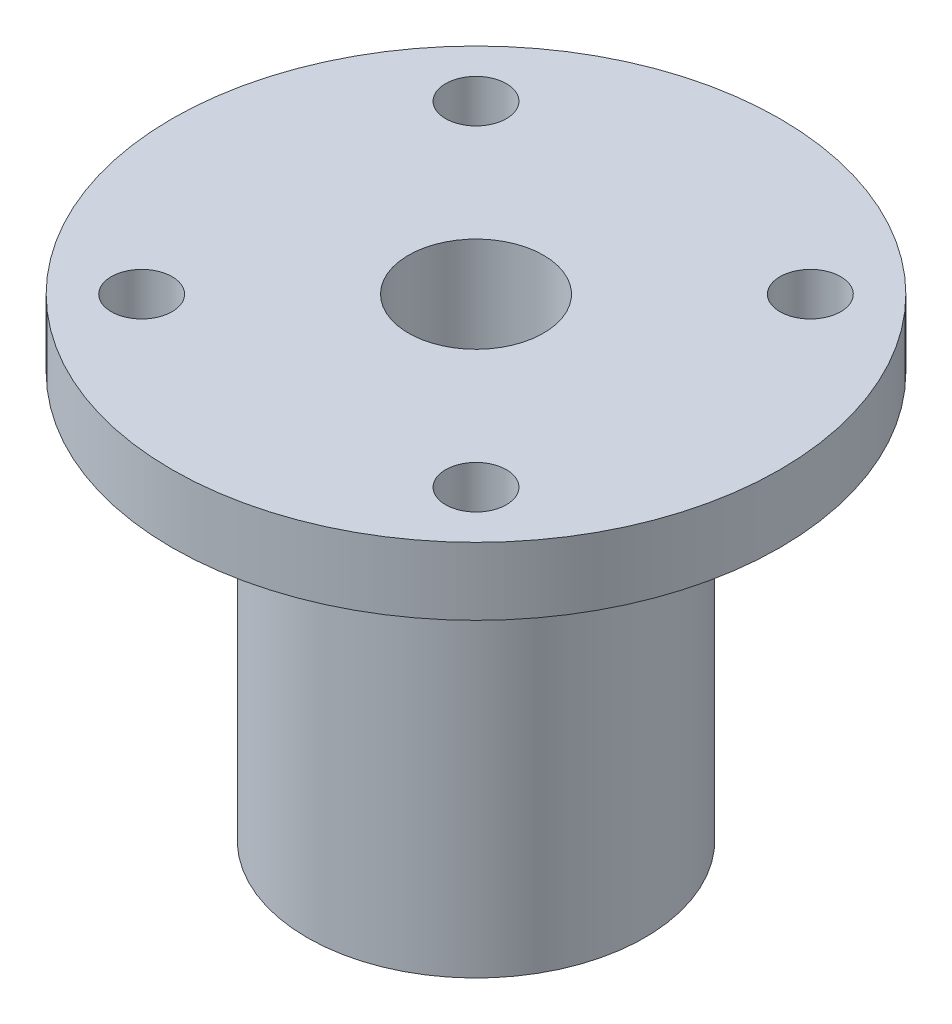
ISO-10303-21;
HEADER;
FILE_DESCRIPTION(('STEP AP214'),'2;1');
FILE_NAME('part.step','',(''),(''),'','','');
FILE_SCHEMA(('AUTOMOTIVE_DESIGN { 1 0 10303 214 1 1 1 1 }'));
ENDSEC;
DATA;
#1=APPLICATION_CONTEXT('core data for automotive mechanical design processes');
#2=APPLICATION_PROTOCOL_DEFINITION('international standard','automotive_design',2000,#1);
#3=PRODUCT_CONTEXT('',#1,'mechanical');
#4=PRODUCT('Part','Part','',(#3));
#5=PRODUCT_RELATED_PRODUCT_CATEGORY('part','',(#4));
#6=PRODUCT_DEFINITION_FORMATION('','',#4);
#7=PRODUCT_DEFINITION_CONTEXT('part definition',#1,'design');
#8=PRODUCT_DEFINITION('design','',#6,#7);
#9=PRODUCT_DEFINITION_SHAPE('','',#8);
#10=(LENGTH_UNIT() NAMED_UNIT(*) SI_UNIT(.MILLI.,.METRE.));
#11=(NAMED_UNIT(*) PLANE_ANGLE_UNIT() SI_UNIT($,.RADIAN.));
#12=(NAMED_UNIT(*) SI_UNIT($,.STERADIAN.) SOLID_ANGLE_UNIT());
#13=UNCERTAINTY_MEASURE_WITH_UNIT(LENGTH_MEASURE(1.E-05),#10,'distance_accuracy_value','');
#14=(GEOMETRIC_REPRESENTATION_CONTEXT(3) GLOBAL_UNCERTAINTY_ASSIGNED_CONTEXT((#13)) GLOBAL_UNIT_ASSIGNED_CONTEXT((#10,
#11,#12)) REPRESENTATION_CONTEXT('',''));
#15=CARTESIAN_POINT('',(0.,0.,0.));
#16=DIRECTION('',(0.,0.,1.));
#17=DIRECTION('',(1.,0.,0.));
#18=AXIS2_PLACEMENT_3D('',#15,#16,#17);
#19=CARTESIAN_POINT('',(0.,0.,0.));
#20=DIRECTION('',(0.,-1.,0.));
#21=DIRECTION('',(0.,0.,-1.));
#22=AXIS2_PLACEMENT_3D('',#19,#20,#21);
#23=CYLINDRICAL_SURFACE('',#22,22.5);
#24=CARTESIAN_POINT('',(0.,35.,0.));
#25=DIRECTION('',(0.,-1.,0.));
#26=DIRECTION('',(0.,0.,-1.));
#27=AXIS2_PLACEMENT_3D('',#24,#25,#26);
#28=CIRCLE('',#27,22.5);
#29=CARTESIAN_POINT('',(0.,35.,-22.5));
#30=VERTEX_POINT('',#29);
#31=EDGE_CURVE('E54',#30,#30,#28,.T.);
#32=ORIENTED_EDGE('',*,*,#31,.T.);
#33=EDGE_LOOP('',(#32));
#34=FACE_BOUND('',#33,.T.);
#35=CARTESIAN_POINT('',(0.,30.,0.));
#36=DIRECTION('',(0.,-1.,0.));
#37=DIRECTION('',(0.,0.,-1.));
#38=AXIS2_PLACEMENT_3D('',#35,#36,#37);
#39=CIRCLE('',#38,22.5);
#40=CARTESIAN_POINT('',(0.,30.,-22.5));
#41=VERTEX_POINT('',#40);
#42=EDGE_CURVE('E10',#41,#41,#39,.T.);
#43=ORIENTED_EDGE('',*,*,#42,.F.);
#44=EDGE_LOOP('',(#43));
#45=FACE_BOUND('',#44,.T.);
#46=ADVANCED_FACE('F32',(#34,#45),#23,.T.);
#47=CARTESIAN_POINT('',(22.5,30.,0.));
#48=DIRECTION('',(0.,-1.,0.));
#49=DIRECTION('',(0.,0.,-1.));
#50=AXIS2_PLACEMENT_3D('',#47,#48,#49);
#51=PLANE('',#50);
#52=CARTESIAN_POINT('',(-12.3743686707646,30.,12.3743686707646));
#53=DIRECTION('',(0.,-1.,0.));
#54=DIRECTION('',(0.,0.,-1.));
#55=AXIS2_PLACEMENT_3D('',#52,#53,#54);
#56=CIRCLE('',#55,2.24999999999999);
#57=CARTESIAN_POINT('',(-12.3743686707646,30.,10.1243686707646));
#58=VERTEX_POINT('',#57);
#59=EDGE_CURVE('E78',#58,#58,#56,.T.);
#60=ORIENTED_EDGE('',*,*,#59,.F.);
#61=EDGE_LOOP('',(#60));
#62=FACE_BOUND('',#61,.T.);
#63=CARTESIAN_POINT('',(-12.3743686707646,30.,-12.3743686707646));
#64=DIRECTION('',(0.,-1.,0.));
#65=DIRECTION('',(0.,0.,-1.));
#66=AXIS2_PLACEMENT_3D('',#63,#64,#65);
#67=CIRCLE('',#66,2.24999999999999);
#68=CARTESIAN_POINT('',(-12.3743686707646,30.,-14.6243686707646));
#69=VERTEX_POINT('',#68);
#70=EDGE_CURVE('E72',#69,#69,#67,.T.);
#71=ORIENTED_EDGE('',*,*,#70,.F.);
#72=EDGE_LOOP('',(#71));
#73=FACE_BOUND('',#72,.T.);
#74=CARTESIAN_POINT('',(12.3743686707646,30.,-12.3743686707646));
#75=DIRECTION('',(0.,-1.,0.));
#76=DIRECTION('',(0.,0.,-1.));
#77=AXIS2_PLACEMENT_3D('',#74,#75,#76);
#78=CIRCLE('',#77,2.24999999999999);
#79=CARTESIAN_POINT('',(12.3743686707646,30.,-14.6243686707646));
#80=VERTEX_POINT('',#79);
#81=EDGE_CURVE('E66',#80,#80,#78,.T.);
#82=ORIENTED_EDGE('',*,*,#81,.F.);
#83=EDGE_LOOP('',(#82));
#84=FACE_BOUND('',#83,.T.);
#85=CARTESIAN_POINT('',(12.3743686707646,30.,12.3743686707646));
#86=DIRECTION('',(0.,-1.,0.));
#87=DIRECTION('',(0.,0.,-1.));
#88=AXIS2_PLACEMENT_3D('',#85,#86,#87);
#89=CIRCLE('',#88,2.24999999999999);
#90=CARTESIAN_POINT('',(12.3743686707646,30.,10.1243686707646));
#91=VERTEX_POINT('',#90);
#92=EDGE_CURVE('E60',#91,#91,#89,.T.);
#93=ORIENTED_EDGE('',*,*,#92,.F.);
#94=EDGE_LOOP('',(#93));
#95=FACE_BOUND('',#94,.T.);
#96=ORIENTED_EDGE('',*,*,#42,.T.);
#97=EDGE_LOOP('',(#96));
#98=FACE_BOUND('',#97,.T.);
#99=CARTESIAN_POINT('',(0.,30.,0.));
#100=DIRECTION('',(0.,-1.,0.));
#101=DIRECTION('',(0.,0.,-1.));
#102=AXIS2_PLACEMENT_3D('',#99,#100,#101);
#103=CIRCLE('',#102,12.5);
#104=CARTESIAN_POINT('',(0.,30.,-12.5));
#105=VERTEX_POINT('',#104);
#106=EDGE_CURVE('E38',#105,#105,#103,.T.);
#107=ORIENTED_EDGE('',*,*,#106,.F.);
#108=EDGE_LOOP('',(#107));
#109=FACE_BOUND('',#108,.T.);
#110=ADVANCED_FACE('F84',(#62,#73,#84,#95,#98,#109),#51,.T.);
#111=CARTESIAN_POINT('',(0.,0.,0.));
#112=DIRECTION('',(0.,-1.,0.));
#113=DIRECTION('',(0.,0.,-1.));
#114=AXIS2_PLACEMENT_3D('',#111,#112,#113);
#115=CYLINDRICAL_SURFACE('',#114,12.5);
#116=ORIENTED_EDGE('',*,*,#106,.T.);
#117=EDGE_LOOP('',(#116));
#118=FACE_BOUND('',#117,.T.);
#119=CARTESIAN_POINT('',(0.,0.,0.));
#120=DIRECTION('',(0.,-1.,0.));
#121=DIRECTION('',(0.,0.,-1.));
#122=AXIS2_PLACEMENT_3D('',#119,#120,#121);
#123=CIRCLE('',#122,12.5);
#124=CARTESIAN_POINT('',(0.,0.,-12.5));
#125=VERTEX_POINT('',#124);
#126=EDGE_CURVE('E42',#125,#125,#123,.T.);
#127=ORIENTED_EDGE('',*,*,#126,.F.);
#128=EDGE_LOOP('',(#127));
#129=FACE_BOUND('',#128,.T.);
#130=ADVANCED_FACE('F87',(#118,#129),#115,.T.);
#131=CARTESIAN_POINT('',(12.5,0.,0.));
#132=DIRECTION('',(0.,-1.,0.));
#133=DIRECTION('',(0.,0.,-1.));
#134=AXIS2_PLACEMENT_3D('',#131,#132,#133);
#135=PLANE('',#134);
#136=ORIENTED_EDGE('',*,*,#126,.T.);
#137=EDGE_LOOP('',(#136));
#138=FACE_BOUND('',#137,.T.);
#139=CARTESIAN_POINT('',(0.,0.,0.));
#140=DIRECTION('',(0.,-1.,0.));
#141=DIRECTION('',(0.,0.,-1.));
#142=AXIS2_PLACEMENT_3D('',#139,#140,#141);
#143=CIRCLE('',#142,5.);
#144=CARTESIAN_POINT('',(0.,0.,-5.));
#145=VERTEX_POINT('',#144);
#146=EDGE_CURVE('E46',#145,#145,#143,.T.);
#147=ORIENTED_EDGE('',*,*,#146,.F.);
#148=EDGE_LOOP('',(#147));
#149=FACE_BOUND('',#148,.T.);
#150=ADVANCED_FACE('F131',(#138,#149),#135,.T.);
#151=CARTESIAN_POINT('',(0.,0.,0.));
#152=DIRECTION('',(0.,-1.,0.));
#153=DIRECTION('',(0.,0.,-1.));
#154=AXIS2_PLACEMENT_3D('',#151,#152,#153);
#155=CYLINDRICAL_SURFACE('',#154,5.);
#156=ORIENTED_EDGE('',*,*,#146,.T.);
#157=EDGE_LOOP('',(#156));
#158=FACE_BOUND('',#157,.T.);
#159=CARTESIAN_POINT('',(0.,35.,0.));
#160=DIRECTION('',(0.,-1.,0.));
#161=DIRECTION('',(0.,0.,-1.));
#162=AXIS2_PLACEMENT_3D('',#159,#160,#161);
#163=CIRCLE('',#162,5.);
#164=CARTESIAN_POINT('',(0.,35.,-5.));
#165=VERTEX_POINT('',#164);
#166=EDGE_CURVE('E51',#165,#165,#163,.T.);
#167=ORIENTED_EDGE('',*,*,#166,.F.);
#168=EDGE_LOOP('',(#167));
#169=FACE_BOUND('',#168,.T.);
#170=ADVANCED_FACE('F108',(#158,#169),#155,.F.);
#171=CARTESIAN_POINT('',(5.,35.,0.));
#172=DIRECTION('',(0.,1.,0.));
#173=DIRECTION('',(0.,0.,1.));
#174=AXIS2_PLACEMENT_3D('',#171,#172,#173);
#175=PLANE('',#174);
#176=CARTESIAN_POINT('',(-12.3743686707646,35.,12.3743686707646));
#177=DIRECTION('',(0.,-1.,0.));
#178=DIRECTION('',(0.,0.,-1.));
#179=AXIS2_PLACEMENT_3D('',#176,#177,#178);
#180=CIRCLE('',#179,2.25);
#181=CARTESIAN_POINT('',(-12.3743686707646,35.,10.1243686707646));
#182=VERTEX_POINT('',#181);
#183=EDGE_CURVE('E75',#182,#182,#180,.T.);
#184=ORIENTED_EDGE('',*,*,#183,.T.);
#185=EDGE_LOOP('',(#184));
#186=FACE_BOUND('',#185,.T.);
#187=CARTESIAN_POINT('',(-12.3743686707646,35.,-12.3743686707646));
#188=DIRECTION('',(0.,-1.,0.));
#189=DIRECTION('',(0.,0.,-1.));
#190=AXIS2_PLACEMENT_3D('',#187,#188,#189);
#191=CIRCLE('',#190,2.25);
#192=CARTESIAN_POINT('',(-12.3743686707646,35.,-14.6243686707646));
#193=VERTEX_POINT('',#192);
#194=EDGE_CURVE('E69',#193,#193,#191,.T.);
#195=ORIENTED_EDGE('',*,*,#194,.T.);
#196=EDGE_LOOP('',(#195));
#197=FACE_BOUND('',#196,.T.);
#198=CARTESIAN_POINT('',(12.3743686707646,35.,-12.3743686707646));
#199=DIRECTION('',(0.,-1.,0.));
#200=DIRECTION('',(0.,0.,-1.));
#201=AXIS2_PLACEMENT_3D('',#198,#199,#200);
#202=CIRCLE('',#201,2.25);
#203=CARTESIAN_POINT('',(12.3743686707646,35.,-14.6243686707646));
#204=VERTEX_POINT('',#203);
#205=EDGE_CURVE('E63',#204,#204,#202,.T.);
#206=ORIENTED_EDGE('',*,*,#205,.T.);
#207=EDGE_LOOP('',(#206));
#208=FACE_BOUND('',#207,.T.);
#209=CARTESIAN_POINT('',(12.3743686707646,35.,12.3743686707646));
#210=DIRECTION('',(0.,-1.,0.));
#211=DIRECTION('',(0.,0.,-1.));
#212=AXIS2_PLACEMENT_3D('',#209,#210,#211);
#213=CIRCLE('',#212,2.25);
#214=CARTESIAN_POINT('',(12.3743686707646,35.,10.1243686707646));
#215=VERTEX_POINT('',#214);
#216=EDGE_CURVE('E57',#215,#215,#213,.T.);
#217=ORIENTED_EDGE('',*,*,#216,.T.);
#218=EDGE_LOOP('',(#217));
#219=FACE_BOUND('',#218,.T.);
#220=ORIENTED_EDGE('',*,*,#166,.T.);
#221=EDGE_LOOP('',(#220));
#222=FACE_BOUND('',#221,.T.);
#223=ORIENTED_EDGE('',*,*,#31,.F.);
#224=EDGE_LOOP('',(#223));
#225=FACE_BOUND('',#224,.T.);
#226=ADVANCED_FACE('F98',(#186,#197,#208,#219,#222,#225),#175,.T.);
#227=CARTESIAN_POINT('',(12.3743686707646,30.,12.3743686707646));
#228=DIRECTION('',(0.,-1.,0.));
#229=DIRECTION('',(0.,0.,-1.));
#230=AXIS2_PLACEMENT_3D('',#227,#228,#229);
#231=CYLINDRICAL_SURFACE('',#230,2.24999999999999);
#232=ORIENTED_EDGE('',*,*,#216,.F.);
#233=EDGE_LOOP('',(#232));
#234=FACE_BOUND('',#233,.T.);
#235=ORIENTED_EDGE('',*,*,#92,.T.);
#236=EDGE_LOOP('',(#235));
#237=FACE_BOUND('',#236,.T.);
#238=ADVANCED_FACE('F95',(#234,#237),#231,.F.);
#239=CARTESIAN_POINT('',(12.3743686707646,30.,-12.3743686707646));
#240=DIRECTION('',(0.,-1.,0.));
#241=DIRECTION('',(0.,0.,-1.));
#242=AXIS2_PLACEMENT_3D('',#239,#240,#241);
#243=CYLINDRICAL_SURFACE('',#242,2.24999999999999);
#244=ORIENTED_EDGE('',*,*,#205,.F.);
#245=EDGE_LOOP('',(#244));
#246=FACE_BOUND('',#245,.T.);
#247=ORIENTED_EDGE('',*,*,#81,.T.);
#248=EDGE_LOOP('',(#247));
#249=FACE_BOUND('',#248,.T.);
#250=ADVANCED_FACE('F97',(#246,#249),#243,.F.);
#251=CARTESIAN_POINT('',(-12.3743686707646,30.,-12.3743686707646));
#252=DIRECTION('',(0.,-1.,0.));
#253=DIRECTION('',(0.,0.,-1.));
#254=AXIS2_PLACEMENT_3D('',#251,#252,#253);
#255=CYLINDRICAL_SURFACE('',#254,2.24999999999999);
#256=ORIENTED_EDGE('',*,*,#194,.F.);
#257=EDGE_LOOP('',(#256));
#258=FACE_BOUND('',#257,.T.);
#259=ORIENTED_EDGE('',*,*,#70,.T.);
#260=EDGE_LOOP('',(#259));
#261=FACE_BOUND('',#260,.T.);
#262=ADVANCED_FACE('F105',(#258,#261),#255,.F.);
#263=CARTESIAN_POINT('',(-12.3743686707646,30.,12.3743686707646));
#264=DIRECTION('',(0.,-1.,0.));
#265=DIRECTION('',(0.,0.,-1.));
#266=AXIS2_PLACEMENT_3D('',#263,#264,#265);
#267=CYLINDRICAL_SURFACE('',#266,2.24999999999999);
#268=ORIENTED_EDGE('',*,*,#183,.F.);
#269=EDGE_LOOP('',(#268));
#270=FACE_BOUND('',#269,.T.);
#271=ORIENTED_EDGE('',*,*,#59,.T.);
#272=EDGE_LOOP('',(#271));
#273=FACE_BOUND('',#272,.T.);
#274=ADVANCED_FACE('F82',(#270,#273),#267,.F.);
#275=CLOSED_SHELL('',(#46,#110,#130,#150,#170,#226,#238,#250,#262,#274));
#276=MANIFOLD_SOLID_BREP('B2',#275);
#277=ADVANCED_BREP_SHAPE_REPRESENTATION('',(#18,#276),#14);
#278=SHAPE_DEFINITION_REPRESENTATION(#9,#277);
ENDSEC;
END-ISO-10303-21;
